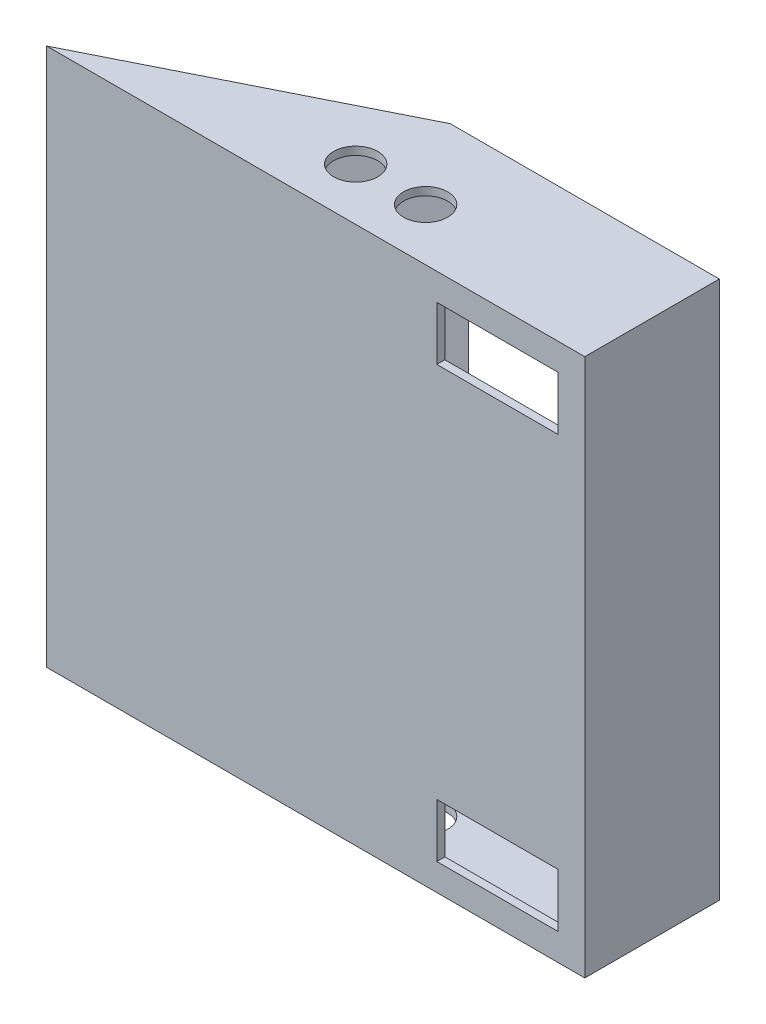
ISO-10303-21;
HEADER;
FILE_DESCRIPTION(('STEP AP214'),'2;1');
FILE_NAME('part.step','',(''),(''),'','','');
FILE_SCHEMA(('AUTOMOTIVE_DESIGN { 1 0 10303 214 1 1 1 1 }'));
ENDSEC;
DATA;
#1=APPLICATION_CONTEXT('core data for automotive mechanical design processes');
#2=APPLICATION_PROTOCOL_DEFINITION('international standard','automotive_design',2000,#1);
#3=PRODUCT_CONTEXT('',#1,'mechanical');
#4=PRODUCT('Part','Part','',(#3));
#5=PRODUCT_RELATED_PRODUCT_CATEGORY('part','',(#4));
#6=PRODUCT_DEFINITION_FORMATION('','',#4);
#7=PRODUCT_DEFINITION_CONTEXT('part definition',#1,'design');
#8=PRODUCT_DEFINITION('design','',#6,#7);
#9=PRODUCT_DEFINITION_SHAPE('','',#8);
#10=(LENGTH_UNIT() NAMED_UNIT(*) SI_UNIT(.MILLI.,.METRE.));
#11=(NAMED_UNIT(*) PLANE_ANGLE_UNIT() SI_UNIT($,.RADIAN.));
#12=(NAMED_UNIT(*) SI_UNIT($,.STERADIAN.) SOLID_ANGLE_UNIT());
#13=UNCERTAINTY_MEASURE_WITH_UNIT(LENGTH_MEASURE(1.E-05),#10,'distance_accuracy_value','');
#14=(GEOMETRIC_REPRESENTATION_CONTEXT(3) GLOBAL_UNCERTAINTY_ASSIGNED_CONTEXT((#13)) GLOBAL_UNIT_ASSIGNED_CONTEXT((#10,
#11,#12)) REPRESENTATION_CONTEXT('',''));
#15=CARTESIAN_POINT('',(0.,0.,0.));
#16=DIRECTION('',(0.,0.,1.));
#17=DIRECTION('',(1.,0.,0.));
#18=AXIS2_PLACEMENT_3D('',#15,#16,#17);
#19=CARTESIAN_POINT('',(200.,200.,-50.));
#20=DIRECTION('',(0.,0.,1.));
#21=DIRECTION('',(1.,0.,0.));
#22=AXIS2_PLACEMENT_3D('',#19,#20,#21);
#23=PLANE('',#22);
#24=DIRECTION('',(-1.,0.,0.));
#25=VECTOR('',#24,1.);
#26=CARTESIAN_POINT('',(200.,0.,-50.));
#27=LINE('',#26,#25);
#28=CARTESIAN_POINT('',(200.,0.,-50.));
#29=VERTEX_POINT('',#28);
#30=CARTESIAN_POINT('',(100.,0.,-50.));
#31=VERTEX_POINT('',#30);
#32=EDGE_CURVE('E276',#29,#31,#27,.T.);
#33=ORIENTED_EDGE('',*,*,#32,.T.);
#34=DIRECTION('',(0.,-1.,0.));
#35=VECTOR('',#34,1.);
#36=CARTESIAN_POINT('',(100.,200.,-50.));
#37=LINE('',#36,#35);
#38=CARTESIAN_POINT('',(100.,200.,-50.));
#39=VERTEX_POINT('',#38);
#40=EDGE_CURVE('E282',#39,#31,#37,.T.);
#41=ORIENTED_EDGE('',*,*,#40,.F.);
#42=DIRECTION('',(-1.,0.,0.));
#43=VECTOR('',#42,1.);
#44=CARTESIAN_POINT('',(200.,200.,-50.));
#45=LINE('',#44,#43);
#46=CARTESIAN_POINT('',(200.,200.,-50.));
#47=VERTEX_POINT('',#46);
#48=EDGE_CURVE('E280',#47,#39,#45,.T.);
#49=ORIENTED_EDGE('',*,*,#48,.F.);
#50=DIRECTION('',(0.,-1.,0.));
#51=VECTOR('',#50,1.);
#52=CARTESIAN_POINT('',(200.,200.,-50.));
#53=LINE('',#52,#51);
#54=EDGE_CURVE('E292',#47,#29,#53,.T.);
#55=ORIENTED_EDGE('',*,*,#54,.T.);
#56=EDGE_LOOP('',(#33,#41,#49,#55));
#57=FACE_BOUND('',#56,.T.);
#58=DIRECTION('',(-1.,0.,0.));
#59=VECTOR('',#58,1.);
#60=CARTESIAN_POINT('',(0.,3.,-50.));
#61=LINE('',#60,#59);
#62=CARTESIAN_POINT('',(197.,3.,-50.));
#63=VERTEX_POINT('',#62);
#64=CARTESIAN_POINT('',(106.708203932499,3.,-50.));
#65=VERTEX_POINT('',#64);
#66=EDGE_CURVE('E252',#63,#65,#61,.T.);
#67=ORIENTED_EDGE('',*,*,#66,.F.);
#68=DIRECTION('',(0.,-1.,0.));
#69=VECTOR('',#68,1.);
#70=CARTESIAN_POINT('',(197.,200.,-50.));
#71=LINE('',#70,#69);
#72=CARTESIAN_POINT('',(197.,197.,-50.));
#73=VERTEX_POINT('',#72);
#74=EDGE_CURVE('E257',#73,#63,#71,.T.);
#75=ORIENTED_EDGE('',*,*,#74,.F.);
#76=DIRECTION('',(-1.,0.,0.));
#77=VECTOR('',#76,1.);
#78=CARTESIAN_POINT('',(0.,197.,-50.));
#79=LINE('',#78,#77);
#80=CARTESIAN_POINT('',(106.708203932499,197.,-50.));
#81=VERTEX_POINT('',#80);
#82=EDGE_CURVE('E263',#73,#81,#79,.T.);
#83=ORIENTED_EDGE('',*,*,#82,.T.);
#84=DIRECTION('',(0.,-1.,0.));
#85=VECTOR('',#84,1.);
#86=CARTESIAN_POINT('',(106.708203932499,200.,-50.));
#87=LINE('',#86,#85);
#88=EDGE_CURVE('E264',#81,#65,#87,.T.);
#89=ORIENTED_EDGE('',*,*,#88,.T.);
#90=EDGE_LOOP('',(#67,#75,#83,#89));
#91=FACE_BOUND('',#90,.T.);
#92=ADVANCED_FACE('F35',(#57,#91),#23,.F.);
#93=CARTESIAN_POINT('',(100.,200.,-50.));
#94=DIRECTION('',(0.447213595499958,0.,0.894427190999916));
#95=DIRECTION('',(0.894427190999916,0.,-0.447213595499958));
#96=AXIS2_PLACEMENT_3D('',#93,#94,#95);
#97=PLANE('',#96);
#98=DIRECTION('',(-0.894427190999916,0.,0.447213595499958));
#99=VECTOR('',#98,1.);
#100=CARTESIAN_POINT('',(100.,0.,-50.));
#101=LINE('',#100,#99);
#102=CARTESIAN_POINT('',(0.,0.,0.));
#103=VERTEX_POINT('',#102);
#104=EDGE_CURVE('E246',#31,#103,#101,.T.);
#105=ORIENTED_EDGE('',*,*,#104,.T.);
#106=DIRECTION('',(0.,-1.,0.));
#107=VECTOR('',#106,1.);
#108=CARTESIAN_POINT('',(0.,200.,0.));
#109=LINE('',#108,#107);
#110=CARTESIAN_POINT('',(0.,200.,0.));
#111=VERTEX_POINT('',#110);
#112=EDGE_CURVE('E11',#111,#103,#109,.T.);
#113=ORIENTED_EDGE('',*,*,#112,.F.);
#114=DIRECTION('',(-0.894427190999916,0.,0.447213595499958));
#115=VECTOR('',#114,1.);
#116=CARTESIAN_POINT('',(100.,200.,-50.));
#117=LINE('',#116,#115);
#118=EDGE_CURVE('E272',#39,#111,#117,.T.);
#119=ORIENTED_EDGE('',*,*,#118,.F.);
#120=ORIENTED_EDGE('',*,*,#40,.T.);
#121=EDGE_LOOP('',(#105,#113,#119,#120));
#122=FACE_BOUND('',#121,.T.);
#123=ADVANCED_FACE('F37',(#122),#97,.F.);
#124=CARTESIAN_POINT('',(0.,200.,0.));
#125=DIRECTION('',(0.,0.,-1.));
#126=DIRECTION('',(-1.,0.,0.));
#127=AXIS2_PLACEMENT_3D('',#124,#125,#126);
#128=PLANE('',#127);
#129=DIRECTION('',(1.,0.,0.));
#130=VECTOR('',#129,1.);
#131=CARTESIAN_POINT('',(190.,30.,0.));
#132=LINE('',#131,#130);
#133=CARTESIAN_POINT('',(145.,30.,0.));
#134=VERTEX_POINT('',#133);
#135=CARTESIAN_POINT('',(190.,30.,0.));
#136=VERTEX_POINT('',#135);
#137=EDGE_CURVE('E162',#134,#136,#132,.T.);
#138=ORIENTED_EDGE('',*,*,#137,.T.);
#139=DIRECTION('',(0.,-1.,0.));
#140=VECTOR('',#139,1.);
#141=CARTESIAN_POINT('',(190.,30.,0.));
#142=LINE('',#141,#140);
#143=CARTESIAN_POINT('',(190.,10.,0.));
#144=VERTEX_POINT('',#143);
#145=EDGE_CURVE('E154',#136,#144,#142,.T.);
#146=ORIENTED_EDGE('',*,*,#145,.T.);
#147=DIRECTION('',(-1.,0.,0.));
#148=VECTOR('',#147,1.);
#149=CARTESIAN_POINT('',(190.,10.,0.));
#150=LINE('',#149,#148);
#151=CARTESIAN_POINT('',(145.,10.,0.));
#152=VERTEX_POINT('',#151);
#153=EDGE_CURVE('E165',#144,#152,#150,.T.);
#154=ORIENTED_EDGE('',*,*,#153,.T.);
#155=DIRECTION('',(0.,1.,0.));
#156=VECTOR('',#155,1.);
#157=CARTESIAN_POINT('',(145.,30.,0.));
#158=LINE('',#157,#156);
#159=EDGE_CURVE('E52',#152,#134,#158,.T.);
#160=ORIENTED_EDGE('',*,*,#159,.T.);
#161=EDGE_LOOP('',(#138,#146,#154,#160));
#162=FACE_BOUND('',#161,.T.);
#163=DIRECTION('',(0.,-1.,0.));
#164=VECTOR('',#163,1.);
#165=CARTESIAN_POINT('',(190.,170.,0.));
#166=LINE('',#165,#164);
#167=CARTESIAN_POINT('',(190.,190.,0.));
#168=VERTEX_POINT('',#167);
#169=CARTESIAN_POINT('',(190.,170.,0.));
#170=VERTEX_POINT('',#169);
#171=EDGE_CURVE('E200',#168,#170,#166,.T.);
#172=ORIENTED_EDGE('',*,*,#171,.T.);
#173=DIRECTION('',(-1.,0.,0.));
#174=VECTOR('',#173,1.);
#175=CARTESIAN_POINT('',(190.,170.,0.));
#176=LINE('',#175,#174);
#177=CARTESIAN_POINT('',(145.,170.,0.));
#178=VERTEX_POINT('',#177);
#179=EDGE_CURVE('E192',#170,#178,#176,.T.);
#180=ORIENTED_EDGE('',*,*,#179,.T.);
#181=DIRECTION('',(0.,1.,0.));
#182=VECTOR('',#181,1.);
#183=CARTESIAN_POINT('',(145.,170.,0.));
#184=LINE('',#183,#182);
#185=CARTESIAN_POINT('',(145.,190.,0.));
#186=VERTEX_POINT('',#185);
#187=EDGE_CURVE('E195',#178,#186,#184,.T.);
#188=ORIENTED_EDGE('',*,*,#187,.T.);
#189=DIRECTION('',(1.,0.,0.));
#190=VECTOR('',#189,1.);
#191=CARTESIAN_POINT('',(190.,190.,0.));
#192=LINE('',#191,#190);
#193=EDGE_CURVE('E60',#186,#168,#192,.T.);
#194=ORIENTED_EDGE('',*,*,#193,.T.);
#195=EDGE_LOOP('',(#172,#180,#188,#194));
#196=FACE_BOUND('',#195,.T.);
#197=DIRECTION('',(1.,0.,0.));
#198=VECTOR('',#197,1.);
#199=CARTESIAN_POINT('',(0.,0.,0.));
#200=LINE('',#199,#198);
#201=CARTESIAN_POINT('',(200.,0.,0.));
#202=VERTEX_POINT('',#201);
#203=EDGE_CURVE('E285',#103,#202,#200,.T.);
#204=ORIENTED_EDGE('',*,*,#203,.T.);
#205=DIRECTION('',(0.,-1.,0.));
#206=VECTOR('',#205,1.);
#207=CARTESIAN_POINT('',(200.,200.,0.));
#208=LINE('',#207,#206);
#209=CARTESIAN_POINT('',(200.,200.,0.));
#210=VERTEX_POINT('',#209);
#211=EDGE_CURVE('E44',#210,#202,#208,.T.);
#212=ORIENTED_EDGE('',*,*,#211,.F.);
#213=DIRECTION('',(1.,0.,0.));
#214=VECTOR('',#213,1.);
#215=CARTESIAN_POINT('',(0.,200.,0.));
#216=LINE('',#215,#214);
#217=EDGE_CURVE('E275',#111,#210,#216,.T.);
#218=ORIENTED_EDGE('',*,*,#217,.F.);
#219=ORIENTED_EDGE('',*,*,#112,.T.);
#220=EDGE_LOOP('',(#204,#212,#218,#219));
#221=FACE_BOUND('',#220,.T.);
#222=ADVANCED_FACE('F169',(#162,#196,#221),#128,.F.);
#223=CARTESIAN_POINT('',(200.,200.,0.));
#224=DIRECTION('',(-1.,0.,0.));
#225=DIRECTION('',(0.,0.,1.));
#226=AXIS2_PLACEMENT_3D('',#223,#224,#225);
#227=PLANE('',#226);
#228=DIRECTION('',(0.,0.,-1.));
#229=VECTOR('',#228,1.);
#230=CARTESIAN_POINT('',(200.,0.,0.));
#231=LINE('',#230,#229);
#232=EDGE_CURVE('E287',#202,#29,#231,.T.);
#233=ORIENTED_EDGE('',*,*,#232,.T.);
#234=ORIENTED_EDGE('',*,*,#54,.F.);
#235=DIRECTION('',(0.,0.,-1.));
#236=VECTOR('',#235,1.);
#237=CARTESIAN_POINT('',(200.,200.,0.));
#238=LINE('',#237,#236);
#239=EDGE_CURVE('E278',#210,#47,#238,.T.);
#240=ORIENTED_EDGE('',*,*,#239,.F.);
#241=ORIENTED_EDGE('',*,*,#211,.T.);
#242=EDGE_LOOP('',(#233,#234,#240,#241));
#243=FACE_BOUND('',#242,.T.);
#244=ADVANCED_FACE('F333',(#243),#227,.F.);
#245=CARTESIAN_POINT('',(0.,200.,0.));
#246=DIRECTION('',(0.,-1.,0.));
#247=DIRECTION('',(0.,0.,-1.));
#248=AXIS2_PLACEMENT_3D('',#245,#246,#247);
#249=PLANE('',#248);
#250=CARTESIAN_POINT('',(121.44280649421,200.,-19.4));
#251=DIRECTION('',(0.,-1.,0.));
#252=DIRECTION('',(0.,0.,-1.));
#253=AXIS2_PLACEMENT_3D('',#250,#251,#252);
#254=CIRCLE('',#253,8.19999999999999);
#255=CARTESIAN_POINT('',(121.44280649421,200.,-27.6));
#256=VERTEX_POINT('',#255);
#257=EDGE_CURVE('E221',#256,#256,#254,.T.);
#258=ORIENTED_EDGE('',*,*,#257,.T.);
#259=EDGE_LOOP('',(#258));
#260=FACE_BOUND('',#259,.T.);
#261=CARTESIAN_POINT('',(95.4428064942104,200.,-19.4));
#262=DIRECTION('',(0.,-1.,0.));
#263=DIRECTION('',(0.,0.,-1.));
#264=AXIS2_PLACEMENT_3D('',#261,#262,#263);
#265=CIRCLE('',#264,8.2);
#266=CARTESIAN_POINT('',(95.4428064942104,200.,-27.6));
#267=VERTEX_POINT('',#266);
#268=EDGE_CURVE('E228',#267,#267,#265,.T.);
#269=ORIENTED_EDGE('',*,*,#268,.T.);
#270=EDGE_LOOP('',(#269));
#271=FACE_BOUND('',#270,.T.);
#272=ORIENTED_EDGE('',*,*,#118,.T.);
#273=ORIENTED_EDGE('',*,*,#217,.T.);
#274=ORIENTED_EDGE('',*,*,#239,.T.);
#275=ORIENTED_EDGE('',*,*,#48,.T.);
#276=EDGE_LOOP('',(#272,#273,#274,#275));
#277=FACE_BOUND('',#276,.T.);
#278=ADVANCED_FACE('F335',(#260,#271,#277),#249,.F.);
#279=CARTESIAN_POINT('',(0.,0.,0.));
#280=DIRECTION('',(0.,-1.,0.));
#281=DIRECTION('',(0.,0.,-1.));
#282=AXIS2_PLACEMENT_3D('',#279,#280,#281);
#283=PLANE('',#282);
#284=CARTESIAN_POINT('',(121.44280649421,0.,-19.4));
#285=DIRECTION('',(0.,-1.,0.));
#286=DIRECTION('',(0.,0.,-1.));
#287=AXIS2_PLACEMENT_3D('',#284,#285,#286);
#288=CIRCLE('',#287,8.19999999999999);
#289=CARTESIAN_POINT('',(121.44280649421,0.,-27.6));
#290=VERTEX_POINT('',#289);
#291=EDGE_CURVE('E225',#290,#290,#288,.T.);
#292=ORIENTED_EDGE('',*,*,#291,.F.);
#293=EDGE_LOOP('',(#292));
#294=FACE_BOUND('',#293,.T.);
#295=CARTESIAN_POINT('',(95.4428064942104,0.,-19.4));
#296=DIRECTION('',(0.,-1.,0.));
#297=DIRECTION('',(0.,0.,-1.));
#298=AXIS2_PLACEMENT_3D('',#295,#296,#297);
#299=CIRCLE('',#298,8.2);
#300=CARTESIAN_POINT('',(95.4428064942104,0.,-27.6));
#301=VERTEX_POINT('',#300);
#302=EDGE_CURVE('E188',#301,#301,#299,.T.);
#303=ORIENTED_EDGE('',*,*,#302,.F.);
#304=EDGE_LOOP('',(#303));
#305=FACE_BOUND('',#304,.T.);
#306=ORIENTED_EDGE('',*,*,#104,.F.);
#307=ORIENTED_EDGE('',*,*,#32,.F.);
#308=ORIENTED_EDGE('',*,*,#232,.F.);
#309=ORIENTED_EDGE('',*,*,#203,.F.);
#310=EDGE_LOOP('',(#306,#307,#308,#309));
#311=FACE_BOUND('',#310,.T.);
#312=ADVANCED_FACE('F331',(#294,#305,#311),#283,.T.);
#313=CARTESIAN_POINT('',(101.3416407865,200.,-47.3167184270003));
#314=DIRECTION('',(0.447213595499958,0.,0.894427190999916));
#315=DIRECTION('',(0.894427190999916,0.,-0.447213595499958));
#316=AXIS2_PLACEMENT_3D('',#313,#314,#315);
#317=PLANE('',#316);
#318=DIRECTION('',(-0.894427190999916,0.,0.447213595499958));
#319=VECTOR('',#318,1.);
#320=CARTESIAN_POINT('',(1.34164078649988,3.,2.68328157299975));
#321=LINE('',#320,#319);
#322=CARTESIAN_POINT('',(12.7082039324994,3.,-3.));
#323=VERTEX_POINT('',#322);
#324=EDGE_CURVE('E239',#65,#323,#321,.T.);
#325=ORIENTED_EDGE('',*,*,#324,.F.);
#326=ORIENTED_EDGE('',*,*,#88,.F.);
#327=DIRECTION('',(-0.894427190999916,0.,0.447213595499958));
#328=VECTOR('',#327,1.);
#329=CARTESIAN_POINT('',(1.34164078649988,197.,2.68328157299975));
#330=LINE('',#329,#328);
#331=CARTESIAN_POINT('',(12.7082039324994,197.,-3.));
#332=VERTEX_POINT('',#331);
#333=EDGE_CURVE('E248',#81,#332,#330,.T.);
#334=ORIENTED_EDGE('',*,*,#333,.T.);
#335=DIRECTION('',(0.,-1.,0.));
#336=VECTOR('',#335,1.);
#337=CARTESIAN_POINT('',(12.7082039324994,200.,-3.));
#338=LINE('',#337,#336);
#339=EDGE_CURVE('E243',#332,#323,#338,.T.);
#340=ORIENTED_EDGE('',*,*,#339,.T.);
#341=EDGE_LOOP('',(#325,#326,#334,#340));
#342=FACE_BOUND('',#341,.T.);
#343=ADVANCED_FACE('F361',(#342),#317,.T.);
#344=CARTESIAN_POINT('',(0.,200.,-3.));
#345=DIRECTION('',(0.,0.,-1.));
#346=DIRECTION('',(-1.,0.,0.));
#347=AXIS2_PLACEMENT_3D('',#344,#345,#346);
#348=PLANE('',#347);
#349=DIRECTION('',(0.,-1.,0.));
#350=VECTOR('',#349,1.);
#351=CARTESIAN_POINT('',(190.,30.,-3.));
#352=LINE('',#351,#350);
#353=CARTESIAN_POINT('',(190.,30.,-3.));
#354=VERTEX_POINT('',#353);
#355=CARTESIAN_POINT('',(190.,10.,-3.));
#356=VERTEX_POINT('',#355);
#357=EDGE_CURVE('E157',#354,#356,#352,.T.);
#358=ORIENTED_EDGE('',*,*,#357,.F.);
#359=DIRECTION('',(1.,0.,0.));
#360=VECTOR('',#359,1.);
#361=CARTESIAN_POINT('',(190.,30.,-3.));
#362=LINE('',#361,#360);
#363=CARTESIAN_POINT('',(145.,30.,-3.));
#364=VERTEX_POINT('',#363);
#365=EDGE_CURVE('E172',#364,#354,#362,.T.);
#366=ORIENTED_EDGE('',*,*,#365,.F.);
#367=DIRECTION('',(0.,1.,0.));
#368=VECTOR('',#367,1.);
#369=CARTESIAN_POINT('',(145.,30.,-3.));
#370=LINE('',#369,#368);
#371=CARTESIAN_POINT('',(145.,10.,-3.));
#372=VERTEX_POINT('',#371);
#373=EDGE_CURVE('E175',#372,#364,#370,.T.);
#374=ORIENTED_EDGE('',*,*,#373,.F.);
#375=DIRECTION('',(-1.,0.,0.));
#376=VECTOR('',#375,1.);
#377=CARTESIAN_POINT('',(190.,10.,-3.));
#378=LINE('',#377,#376);
#379=EDGE_CURVE('E181',#356,#372,#378,.T.);
#380=ORIENTED_EDGE('',*,*,#379,.F.);
#381=EDGE_LOOP('',(#358,#366,#374,#380));
#382=FACE_BOUND('',#381,.T.);
#383=DIRECTION('',(-1.,0.,0.));
#384=VECTOR('',#383,1.);
#385=CARTESIAN_POINT('',(190.,170.,-3.));
#386=LINE('',#385,#384);
#387=CARTESIAN_POINT('',(190.,170.,-3.));
#388=VERTEX_POINT('',#387);
#389=CARTESIAN_POINT('',(145.,170.,-3.));
#390=VERTEX_POINT('',#389);
#391=EDGE_CURVE('E204',#388,#390,#386,.T.);
#392=ORIENTED_EDGE('',*,*,#391,.F.);
#393=DIRECTION('',(0.,-1.,0.));
#394=VECTOR('',#393,1.);
#395=CARTESIAN_POINT('',(190.,170.,-3.));
#396=LINE('',#395,#394);
#397=CARTESIAN_POINT('',(190.,190.,-3.));
#398=VERTEX_POINT('',#397);
#399=EDGE_CURVE('E196',#398,#388,#396,.T.);
#400=ORIENTED_EDGE('',*,*,#399,.F.);
#401=DIRECTION('',(1.,0.,0.));
#402=VECTOR('',#401,1.);
#403=CARTESIAN_POINT('',(190.,190.,-3.));
#404=LINE('',#403,#402);
#405=CARTESIAN_POINT('',(145.,190.,-3.));
#406=VERTEX_POINT('',#405);
#407=EDGE_CURVE('E209',#406,#398,#404,.T.);
#408=ORIENTED_EDGE('',*,*,#407,.F.);
#409=DIRECTION('',(0.,1.,0.));
#410=VECTOR('',#409,1.);
#411=CARTESIAN_POINT('',(145.,170.,-3.));
#412=LINE('',#411,#410);
#413=EDGE_CURVE('E206',#390,#406,#412,.T.);
#414=ORIENTED_EDGE('',*,*,#413,.F.);
#415=EDGE_LOOP('',(#392,#400,#408,#414));
#416=FACE_BOUND('',#415,.T.);
#417=DIRECTION('',(1.,0.,0.));
#418=VECTOR('',#417,1.);
#419=CARTESIAN_POINT('',(0.,3.,-3.));
#420=LINE('',#419,#418);
#421=CARTESIAN_POINT('',(197.,3.,-3.));
#422=VERTEX_POINT('',#421);
#423=EDGE_CURVE('E242',#323,#422,#420,.T.);
#424=ORIENTED_EDGE('',*,*,#423,.F.);
#425=ORIENTED_EDGE('',*,*,#339,.F.);
#426=DIRECTION('',(1.,0.,0.));
#427=VECTOR('',#426,1.);
#428=CARTESIAN_POINT('',(0.,197.,-3.));
#429=LINE('',#428,#427);
#430=CARTESIAN_POINT('',(197.,197.,-3.));
#431=VERTEX_POINT('',#430);
#432=EDGE_CURVE('E251',#332,#431,#429,.T.);
#433=ORIENTED_EDGE('',*,*,#432,.T.);
#434=DIRECTION('',(0.,-1.,0.));
#435=VECTOR('',#434,1.);
#436=CARTESIAN_POINT('',(197.,200.,-3.));
#437=LINE('',#436,#435);
#438=EDGE_CURVE('E247',#431,#422,#437,.T.);
#439=ORIENTED_EDGE('',*,*,#438,.T.);
#440=EDGE_LOOP('',(#424,#425,#433,#439));
#441=FACE_BOUND('',#440,.T.);
#442=ADVANCED_FACE('F369',(#382,#416,#441),#348,.T.);
#443=CARTESIAN_POINT('',(197.,200.,0.));
#444=DIRECTION('',(-1.,0.,0.));
#445=DIRECTION('',(0.,0.,1.));
#446=AXIS2_PLACEMENT_3D('',#443,#444,#445);
#447=PLANE('',#446);
#448=DIRECTION('',(0.,0.,-1.));
#449=VECTOR('',#448,1.);
#450=CARTESIAN_POINT('',(197.,3.,0.));
#451=LINE('',#450,#449);
#452=EDGE_CURVE('E254',#422,#63,#451,.T.);
#453=ORIENTED_EDGE('',*,*,#452,.F.);
#454=ORIENTED_EDGE('',*,*,#438,.F.);
#455=DIRECTION('',(0.,0.,-1.));
#456=VECTOR('',#455,1.);
#457=CARTESIAN_POINT('',(197.,197.,0.));
#458=LINE('',#457,#456);
#459=EDGE_CURVE('E259',#431,#73,#458,.T.);
#460=ORIENTED_EDGE('',*,*,#459,.T.);
#461=ORIENTED_EDGE('',*,*,#74,.T.);
#462=EDGE_LOOP('',(#453,#454,#460,#461));
#463=FACE_BOUND('',#462,.T.);
#464=ADVANCED_FACE('F375',(#463),#447,.T.);
#465=CARTESIAN_POINT('',(0.,197.,0.));
#466=DIRECTION('',(0.,-1.,0.));
#467=DIRECTION('',(0.,0.,-1.));
#468=AXIS2_PLACEMENT_3D('',#465,#466,#467);
#469=PLANE('',#468);
#470=CARTESIAN_POINT('',(121.44280649421,197.,-19.4));
#471=DIRECTION('',(0.,-1.,0.));
#472=DIRECTION('',(0.,0.,-1.));
#473=AXIS2_PLACEMENT_3D('',#470,#471,#472);
#474=CIRCLE('',#473,8.19999999999999);
#475=CARTESIAN_POINT('',(121.44280649421,197.,-27.6));
#476=VERTEX_POINT('',#475);
#477=EDGE_CURVE('E236',#476,#476,#474,.T.);
#478=ORIENTED_EDGE('',*,*,#477,.F.);
#479=EDGE_LOOP('',(#478));
#480=FACE_BOUND('',#479,.T.);
#481=CARTESIAN_POINT('',(95.4428064942104,197.,-19.4));
#482=DIRECTION('',(0.,-1.,0.));
#483=DIRECTION('',(0.,0.,-1.));
#484=AXIS2_PLACEMENT_3D('',#481,#482,#483);
#485=CIRCLE('',#484,8.2);
#486=CARTESIAN_POINT('',(95.4428064942104,197.,-27.6));
#487=VERTEX_POINT('',#486);
#488=EDGE_CURVE('E233',#487,#487,#485,.T.);
#489=ORIENTED_EDGE('',*,*,#488,.F.);
#490=EDGE_LOOP('',(#489));
#491=FACE_BOUND('',#490,.T.);
#492=ORIENTED_EDGE('',*,*,#333,.F.);
#493=ORIENTED_EDGE('',*,*,#82,.F.);
#494=ORIENTED_EDGE('',*,*,#459,.F.);
#495=ORIENTED_EDGE('',*,*,#432,.F.);
#496=EDGE_LOOP('',(#492,#493,#494,#495));
#497=FACE_BOUND('',#496,.T.);
#498=ADVANCED_FACE('F315',(#480,#491,#497),#469,.T.);
#499=CARTESIAN_POINT('',(0.,3.,0.));
#500=DIRECTION('',(0.,-1.,0.));
#501=DIRECTION('',(0.,0.,-1.));
#502=AXIS2_PLACEMENT_3D('',#499,#500,#501);
#503=PLANE('',#502);
#504=CARTESIAN_POINT('',(121.44280649421,3.,-19.4));
#505=DIRECTION('',(0.,-1.,0.));
#506=DIRECTION('',(0.,0.,-1.));
#507=AXIS2_PLACEMENT_3D('',#504,#505,#506);
#508=CIRCLE('',#507,8.19999999999999);
#509=CARTESIAN_POINT('',(121.44280649421,3.,-27.6));
#510=VERTEX_POINT('',#509);
#511=EDGE_CURVE('E39',#510,#510,#508,.T.);
#512=ORIENTED_EDGE('',*,*,#511,.T.);
#513=EDGE_LOOP('',(#512));
#514=FACE_BOUND('',#513,.T.);
#515=CARTESIAN_POINT('',(95.4428064942104,3.,-19.4));
#516=DIRECTION('',(0.,-1.,0.));
#517=DIRECTION('',(0.,0.,-1.));
#518=AXIS2_PLACEMENT_3D('',#515,#516,#517);
#519=CIRCLE('',#518,8.2);
#520=CARTESIAN_POINT('',(95.4428064942104,3.,-27.6));
#521=VERTEX_POINT('',#520);
#522=EDGE_CURVE('E224',#521,#521,#519,.T.);
#523=ORIENTED_EDGE('',*,*,#522,.T.);
#524=EDGE_LOOP('',(#523));
#525=FACE_BOUND('',#524,.T.);
#526=ORIENTED_EDGE('',*,*,#324,.T.);
#527=ORIENTED_EDGE('',*,*,#423,.T.);
#528=ORIENTED_EDGE('',*,*,#452,.T.);
#529=ORIENTED_EDGE('',*,*,#66,.T.);
#530=EDGE_LOOP('',(#526,#527,#528,#529));
#531=FACE_BOUND('',#530,.T.);
#532=ADVANCED_FACE('F299',(#514,#525,#531),#503,.F.);
#533=CARTESIAN_POINT('',(95.4428064942104,200.,-19.4));
#534=DIRECTION('',(0.,-1.,0.));
#535=DIRECTION('',(0.,0.,-1.));
#536=AXIS2_PLACEMENT_3D('',#533,#534,#535);
#537=CYLINDRICAL_SURFACE('',#536,8.2);
#538=ORIENTED_EDGE('',*,*,#302,.T.);
#539=EDGE_LOOP('',(#538));
#540=FACE_BOUND('',#539,.T.);
#541=ORIENTED_EDGE('',*,*,#522,.F.);
#542=EDGE_LOOP('',(#541));
#543=FACE_BOUND('',#542,.T.);
#544=ADVANCED_FACE('F302',(#540,#543),#537,.F.);
#545=CARTESIAN_POINT('',(121.44280649421,200.,-19.4));
#546=DIRECTION('',(0.,-1.,0.));
#547=DIRECTION('',(0.,0.,-1.));
#548=AXIS2_PLACEMENT_3D('',#545,#546,#547);
#549=CYLINDRICAL_SURFACE('',#548,8.19999999999999);
#550=ORIENTED_EDGE('',*,*,#291,.T.);
#551=EDGE_LOOP('',(#550));
#552=FACE_BOUND('',#551,.T.);
#553=ORIENTED_EDGE('',*,*,#511,.F.);
#554=EDGE_LOOP('',(#553));
#555=FACE_BOUND('',#554,.T.);
#556=ADVANCED_FACE('F304',(#552,#555),#549,.F.);
#557=ORIENTED_EDGE('',*,*,#488,.T.);
#558=EDGE_LOOP('',(#557));
#559=FACE_BOUND('',#558,.T.);
#560=ORIENTED_EDGE('',*,*,#268,.F.);
#561=EDGE_LOOP('',(#560));
#562=FACE_BOUND('',#561,.T.);
#563=ADVANCED_FACE('F307',(#559,#562),#537,.F.);
#564=ORIENTED_EDGE('',*,*,#477,.T.);
#565=EDGE_LOOP('',(#564));
#566=FACE_BOUND('',#565,.T.);
#567=ORIENTED_EDGE('',*,*,#257,.F.);
#568=EDGE_LOOP('',(#567));
#569=FACE_BOUND('',#568,.T.);
#570=ADVANCED_FACE('F314',(#566,#569),#549,.F.);
#571=CARTESIAN_POINT('',(190.,170.,0.));
#572=DIRECTION('',(0.,-1.,0.));
#573=DIRECTION('',(0.,0.,-1.));
#574=AXIS2_PLACEMENT_3D('',#571,#572,#573);
#575=PLANE('',#574);
#576=ORIENTED_EDGE('',*,*,#391,.T.);
#577=DIRECTION('',(0.,0.,-1.));
#578=VECTOR('',#577,1.);
#579=CARTESIAN_POINT('',(145.,170.,0.));
#580=LINE('',#579,#578);
#581=EDGE_CURVE('E203',#178,#390,#580,.T.);
#582=ORIENTED_EDGE('',*,*,#581,.F.);
#583=ORIENTED_EDGE('',*,*,#179,.F.);
#584=DIRECTION('',(0.,0.,-1.));
#585=VECTOR('',#584,1.);
#586=CARTESIAN_POINT('',(190.,170.,0.));
#587=LINE('',#586,#585);
#588=EDGE_CURVE('E182',#170,#388,#587,.T.);
#589=ORIENTED_EDGE('',*,*,#588,.T.);
#590=EDGE_LOOP('',(#576,#582,#583,#589));
#591=FACE_BOUND('',#590,.T.);
#592=ADVANCED_FACE('F417',(#591),#575,.F.);
#593=CARTESIAN_POINT('',(190.,170.,0.));
#594=DIRECTION('',(1.,0.,0.));
#595=DIRECTION('',(0.,0.,-1.));
#596=AXIS2_PLACEMENT_3D('',#593,#594,#595);
#597=PLANE('',#596);
#598=ORIENTED_EDGE('',*,*,#399,.T.);
#599=ORIENTED_EDGE('',*,*,#588,.F.);
#600=ORIENTED_EDGE('',*,*,#171,.F.);
#601=DIRECTION('',(0.,0.,-1.));
#602=VECTOR('',#601,1.);
#603=CARTESIAN_POINT('',(190.,190.,0.));
#604=LINE('',#603,#602);
#605=EDGE_CURVE('E215',#168,#398,#604,.T.);
#606=ORIENTED_EDGE('',*,*,#605,.T.);
#607=EDGE_LOOP('',(#598,#599,#600,#606));
#608=FACE_BOUND('',#607,.T.);
#609=ADVANCED_FACE('F426',(#608),#597,.F.);
#610=CARTESIAN_POINT('',(190.,190.,0.));
#611=DIRECTION('',(0.,1.,0.));
#612=DIRECTION('',(-1.,0.,0.));
#613=AXIS2_PLACEMENT_3D('',#610,#611,#612);
#614=PLANE('',#613);
#615=ORIENTED_EDGE('',*,*,#407,.T.);
#616=ORIENTED_EDGE('',*,*,#605,.F.);
#617=ORIENTED_EDGE('',*,*,#193,.F.);
#618=DIRECTION('',(0.,0.,-1.));
#619=VECTOR('',#618,1.);
#620=CARTESIAN_POINT('',(145.,190.,0.));
#621=LINE('',#620,#619);
#622=EDGE_CURVE('E217',#186,#406,#621,.T.);
#623=ORIENTED_EDGE('',*,*,#622,.T.);
#624=EDGE_LOOP('',(#615,#616,#617,#623));
#625=FACE_BOUND('',#624,.T.);
#626=ADVANCED_FACE('F433',(#625),#614,.F.);
#627=CARTESIAN_POINT('',(145.,170.,0.));
#628=DIRECTION('',(-1.,0.,0.));
#629=DIRECTION('',(0.,0.,1.));
#630=AXIS2_PLACEMENT_3D('',#627,#628,#629);
#631=PLANE('',#630);
#632=ORIENTED_EDGE('',*,*,#413,.T.);
#633=ORIENTED_EDGE('',*,*,#622,.F.);
#634=ORIENTED_EDGE('',*,*,#187,.F.);
#635=ORIENTED_EDGE('',*,*,#581,.T.);
#636=EDGE_LOOP('',(#632,#633,#634,#635));
#637=FACE_BOUND('',#636,.T.);
#638=ADVANCED_FACE('F441',(#637),#631,.F.);
#639=CARTESIAN_POINT('',(190.,30.,0.));
#640=DIRECTION('',(1.,0.,0.));
#641=DIRECTION('',(0.,0.,-1.));
#642=AXIS2_PLACEMENT_3D('',#639,#640,#641);
#643=PLANE('',#642);
#644=ORIENTED_EDGE('',*,*,#357,.T.);
#645=DIRECTION('',(0.,0.,-1.));
#646=VECTOR('',#645,1.);
#647=CARTESIAN_POINT('',(190.,10.,0.));
#648=LINE('',#647,#646);
#649=EDGE_CURVE('E150',#144,#356,#648,.T.);
#650=ORIENTED_EDGE('',*,*,#649,.F.);
#651=ORIENTED_EDGE('',*,*,#145,.F.);
#652=DIRECTION('',(0.,0.,-1.));
#653=VECTOR('',#652,1.);
#654=CARTESIAN_POINT('',(190.,30.,0.));
#655=LINE('',#654,#653);
#656=EDGE_CURVE('E186',#136,#354,#655,.T.);
#657=ORIENTED_EDGE('',*,*,#656,.T.);
#658=EDGE_LOOP('',(#644,#650,#651,#657));
#659=FACE_BOUND('',#658,.T.);
#660=ADVANCED_FACE('F152',(#659),#643,.F.);
#661=CARTESIAN_POINT('',(190.,30.,0.));
#662=DIRECTION('',(0.,1.,0.));
#663=DIRECTION('',(0.,0.,1.));
#664=AXIS2_PLACEMENT_3D('',#661,#662,#663);
#665=PLANE('',#664);
#666=ORIENTED_EDGE('',*,*,#365,.T.);
#667=ORIENTED_EDGE('',*,*,#656,.F.);
#668=ORIENTED_EDGE('',*,*,#137,.F.);
#669=DIRECTION('',(0.,0.,-1.));
#670=VECTOR('',#669,1.);
#671=CARTESIAN_POINT('',(145.,30.,0.));
#672=LINE('',#671,#670);
#673=EDGE_CURVE('E189',#134,#364,#672,.T.);
#674=ORIENTED_EDGE('',*,*,#673,.T.);
#675=EDGE_LOOP('',(#666,#667,#668,#674));
#676=FACE_BOUND('',#675,.T.);
#677=ADVANCED_FACE('F455',(#676),#665,.F.);
#678=CARTESIAN_POINT('',(145.,30.,0.));
#679=DIRECTION('',(-1.,0.,0.));
#680=DIRECTION('',(0.,0.,1.));
#681=AXIS2_PLACEMENT_3D('',#678,#679,#680);
#682=PLANE('',#681);
#683=ORIENTED_EDGE('',*,*,#373,.T.);
#684=ORIENTED_EDGE('',*,*,#673,.F.);
#685=ORIENTED_EDGE('',*,*,#159,.F.);
#686=DIRECTION('',(0.,0.,-1.));
#687=VECTOR('',#686,1.);
#688=CARTESIAN_POINT('',(145.,10.,0.));
#689=LINE('',#688,#687);
#690=EDGE_CURVE('E161',#152,#372,#689,.T.);
#691=ORIENTED_EDGE('',*,*,#690,.T.);
#692=EDGE_LOOP('',(#683,#684,#685,#691));
#693=FACE_BOUND('',#692,.T.);
#694=ADVANCED_FACE('F462',(#693),#682,.F.);
#695=CARTESIAN_POINT('',(190.,10.,0.));
#696=DIRECTION('',(0.,-1.,0.));
#697=DIRECTION('',(1.,0.,0.));
#698=AXIS2_PLACEMENT_3D('',#695,#696,#697);
#699=PLANE('',#698);
#700=ORIENTED_EDGE('',*,*,#379,.T.);
#701=ORIENTED_EDGE('',*,*,#690,.F.);
#702=ORIENTED_EDGE('',*,*,#153,.F.);
#703=ORIENTED_EDGE('',*,*,#649,.T.);
#704=EDGE_LOOP('',(#700,#701,#702,#703));
#705=FACE_BOUND('',#704,.T.);
#706=ADVANCED_FACE('F166',(#705),#699,.F.);
#707=CLOSED_SHELL('',(#92,#123,#222,#244,#278,#312,#343,#442,#464,#498,#532,#544,#556,#563,#570,
#592,#609,#626,#638,#660,#677,#694,#706));
#708=MANIFOLD_SOLID_BREP('B2',#707);
#709=ADVANCED_BREP_SHAPE_REPRESENTATION('',(#18,#708),#14);
#710=SHAPE_DEFINITION_REPRESENTATION(#9,#709);
ENDSEC;
END-ISO-10303-21;
